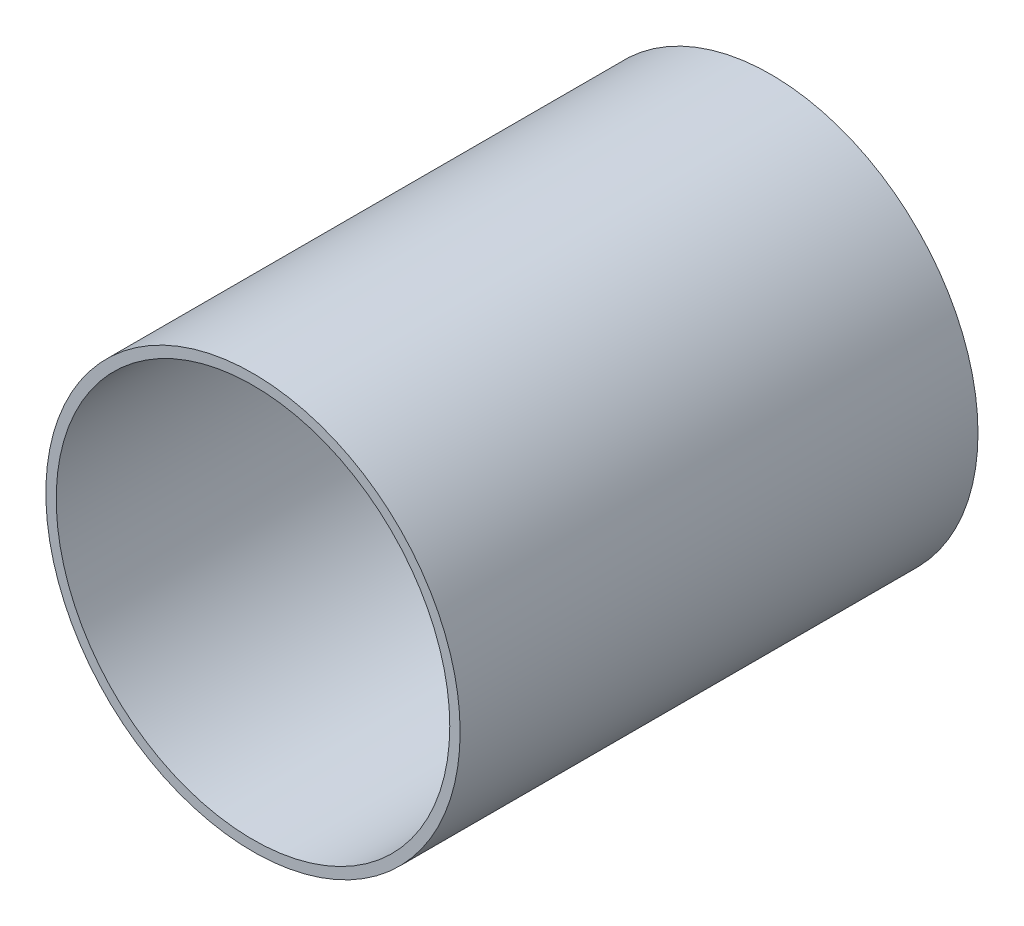
ISO-10303-21;
HEADER;
FILE_DESCRIPTION(('STEP AP214'),'2;1');
FILE_NAME('part.step','',(''),(''),'','','');
FILE_SCHEMA(('AUTOMOTIVE_DESIGN { 1 0 10303 214 1 1 1 1 }'));
ENDSEC;
DATA;
#1=APPLICATION_CONTEXT('core data for automotive mechanical design processes');
#2=APPLICATION_PROTOCOL_DEFINITION('international standard','automotive_design',2000,#1);
#3=PRODUCT_CONTEXT('',#1,'mechanical');
#4=PRODUCT('Part','Part','',(#3));
#5=PRODUCT_RELATED_PRODUCT_CATEGORY('part','',(#4));
#6=PRODUCT_DEFINITION_FORMATION('','',#4);
#7=PRODUCT_DEFINITION_CONTEXT('part definition',#1,'design');
#8=PRODUCT_DEFINITION('design','',#6,#7);
#9=PRODUCT_DEFINITION_SHAPE('','',#8);
#10=(LENGTH_UNIT() NAMED_UNIT(*) SI_UNIT(.MILLI.,.METRE.));
#11=(NAMED_UNIT(*) PLANE_ANGLE_UNIT() SI_UNIT($,.RADIAN.));
#12=(NAMED_UNIT(*) SI_UNIT($,.STERADIAN.) SOLID_ANGLE_UNIT());
#13=UNCERTAINTY_MEASURE_WITH_UNIT(LENGTH_MEASURE(1.E-05),#10,'distance_accuracy_value','');
#14=(GEOMETRIC_REPRESENTATION_CONTEXT(3) GLOBAL_UNCERTAINTY_ASSIGNED_CONTEXT((#13)) GLOBAL_UNIT_ASSIGNED_CONTEXT((#10,
#11,#12)) REPRESENTATION_CONTEXT('',''));
#15=CARTESIAN_POINT('',(0.,0.,0.));
#16=DIRECTION('',(0.,0.,1.));
#17=DIRECTION('',(1.,0.,0.));
#18=AXIS2_PLACEMENT_3D('',#15,#16,#17);
#19=CARTESIAN_POINT('',(0.,0.,1.));
#20=DIRECTION('',(0.,0.,-1.));
#21=DIRECTION('',(-1.,0.,0.));
#22=AXIS2_PLACEMENT_3D('',#19,#20,#21);
#23=CYLINDRICAL_SURFACE('',#22,40.);
#24=CARTESIAN_POINT('',(0.,0.,-1.));
#25=DIRECTION('',(0.,0.,1.));
#26=DIRECTION('',(1.,0.,0.));
#27=AXIS2_PLACEMENT_3D('',#24,#25,#26);
#28=CIRCLE('',#27,40.);
#29=CARTESIAN_POINT('',(40.,0.,-1.));
#30=VERTEX_POINT('',#29);
#31=EDGE_CURVE('E43',#30,#30,#28,.T.);
#32=ORIENTED_EDGE('',*,*,#31,.T.);
#33=EDGE_LOOP('',(#32));
#34=FACE_BOUND('',#33,.T.);
#35=CARTESIAN_POINT('',(0.,0.,99.));
#36=DIRECTION('',(0.,0.,1.));
#37=DIRECTION('',(1.,0.,0.));
#38=AXIS2_PLACEMENT_3D('',#35,#36,#37);
#39=CIRCLE('',#38,40.);
#40=CARTESIAN_POINT('',(40.,0.,99.));
#41=VERTEX_POINT('',#40);
#42=EDGE_CURVE('E47',#41,#41,#39,.T.);
#43=ORIENTED_EDGE('',*,*,#42,.F.);
#44=EDGE_LOOP('',(#43));
#45=FACE_BOUND('',#44,.T.);
#46=ADVANCED_FACE('F37',(#34,#45),#23,.T.);
#47=CARTESIAN_POINT('',(0.,0.,-1.));
#48=DIRECTION('',(0.,0.,1.));
#49=DIRECTION('',(1.,0.,0.));
#50=AXIS2_PLACEMENT_3D('',#47,#48,#49);
#51=PLANE('',#50);
#52=ORIENTED_EDGE('',*,*,#31,.F.);
#53=EDGE_LOOP('',(#52));
#54=FACE_BOUND('',#53,.T.);
#55=ADVANCED_FACE('F61',(#54),#51,.F.);
#56=CARTESIAN_POINT('',(0.,0.,99.));
#57=DIRECTION('',(0.,0.,1.));
#58=DIRECTION('',(1.,0.,0.));
#59=AXIS2_PLACEMENT_3D('',#56,#57,#58);
#60=PLANE('',#59);
#61=ORIENTED_EDGE('',*,*,#42,.T.);
#62=EDGE_LOOP('',(#61));
#63=FACE_BOUND('',#62,.T.);
#64=CARTESIAN_POINT('',(0.,0.,99.));
#65=DIRECTION('',(0.,0.,1.));
#66=DIRECTION('',(1.,0.,0.));
#67=AXIS2_PLACEMENT_3D('',#64,#65,#66);
#68=CIRCLE('',#67,38.);
#69=CARTESIAN_POINT('',(38.,0.,99.));
#70=VERTEX_POINT('',#69);
#71=EDGE_CURVE('E51',#70,#70,#68,.T.);
#72=ORIENTED_EDGE('',*,*,#71,.F.);
#73=EDGE_LOOP('',(#72));
#74=FACE_BOUND('',#73,.T.);
#75=ADVANCED_FACE('F59',(#63,#74),#60,.T.);
#76=CARTESIAN_POINT('',(0.,0.,99.));
#77=DIRECTION('',(0.,0.,-1.));
#78=DIRECTION('',(-1.,0.,0.));
#79=AXIS2_PLACEMENT_3D('',#76,#77,#78);
#80=CYLINDRICAL_SURFACE('',#79,38.);
#81=ORIENTED_EDGE('',*,*,#71,.T.);
#82=EDGE_LOOP('',(#81));
#83=FACE_BOUND('',#82,.T.);
#84=CARTESIAN_POINT('',(0.,0.,1.));
#85=DIRECTION('',(0.,0.,1.));
#86=DIRECTION('',(1.,0.,0.));
#87=AXIS2_PLACEMENT_3D('',#84,#85,#86);
#88=CIRCLE('',#87,38.);
#89=CARTESIAN_POINT('',(38.,0.,1.));
#90=VERTEX_POINT('',#89);
#91=EDGE_CURVE('E10',#90,#90,#88,.F.);
#92=ORIENTED_EDGE('',*,*,#91,.T.);
#93=EDGE_LOOP('',(#92));
#94=FACE_BOUND('',#93,.T.);
#95=ADVANCED_FACE('F57',(#83,#94),#80,.F.);
#96=CARTESIAN_POINT('',(0.,0.,1.));
#97=DIRECTION('',(0.,0.,1.));
#98=DIRECTION('',(1.,0.,0.));
#99=AXIS2_PLACEMENT_3D('',#96,#97,#98);
#100=PLANE('',#99);
#101=ORIENTED_EDGE('',*,*,#91,.F.);
#102=EDGE_LOOP('',(#101));
#103=FACE_BOUND('',#102,.T.);
#104=ADVANCED_FACE('F68',(#103),#100,.T.);
#105=CLOSED_SHELL('',(#46,#55,#75,#95,#104));
#106=MANIFOLD_SOLID_BREP('B2',#105);
#107=ADVANCED_BREP_SHAPE_REPRESENTATION('',(#18,#106),#14);
#108=SHAPE_DEFINITION_REPRESENTATION(#9,#107);
ENDSEC;
END-ISO-10303-21;
